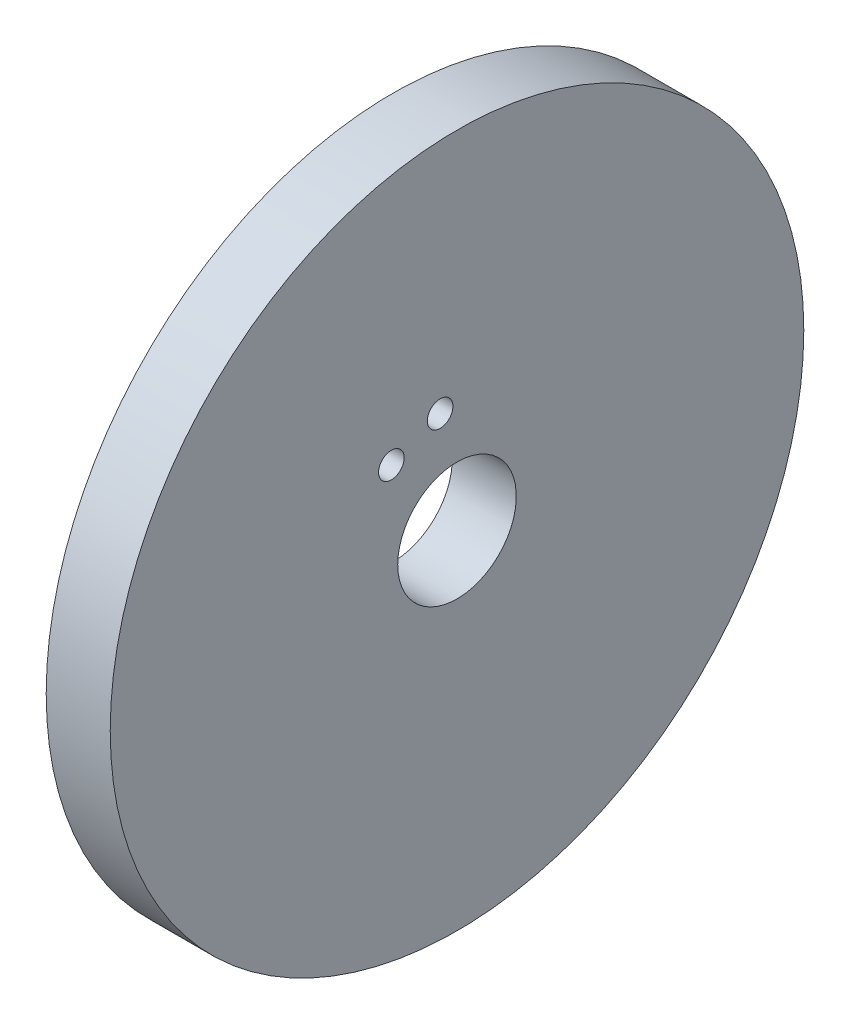
ISO-10303-21;
HEADER;
FILE_DESCRIPTION(('STEP AP214'),'2;1');
FILE_NAME('part.step','',(''),(''),'','','');
FILE_SCHEMA(('AUTOMOTIVE_DESIGN { 1 0 10303 214 1 1 1 1 }'));
ENDSEC;
DATA;
#1=APPLICATION_CONTEXT('core data for automotive mechanical design processes');
#2=APPLICATION_PROTOCOL_DEFINITION('international standard','automotive_design',2000,#1);
#3=PRODUCT_CONTEXT('',#1,'mechanical');
#4=PRODUCT('Part','Part','',(#3));
#5=PRODUCT_RELATED_PRODUCT_CATEGORY('part','',(#4));
#6=PRODUCT_DEFINITION_FORMATION('','',#4);
#7=PRODUCT_DEFINITION_CONTEXT('part definition',#1,'design');
#8=PRODUCT_DEFINITION('design','',#6,#7);
#9=PRODUCT_DEFINITION_SHAPE('','',#8);
#10=(LENGTH_UNIT() NAMED_UNIT(*) SI_UNIT(.MILLI.,.METRE.));
#11=(NAMED_UNIT(*) PLANE_ANGLE_UNIT() SI_UNIT($,.RADIAN.));
#12=(NAMED_UNIT(*) SI_UNIT($,.STERADIAN.) SOLID_ANGLE_UNIT());
#13=UNCERTAINTY_MEASURE_WITH_UNIT(LENGTH_MEASURE(1.E-05),#10,'distance_accuracy_value','');
#14=(GEOMETRIC_REPRESENTATION_CONTEXT(3) GLOBAL_UNCERTAINTY_ASSIGNED_CONTEXT((#13)) GLOBAL_UNIT_ASSIGNED_CONTEXT((#10,
#11,#12)) REPRESENTATION_CONTEXT('',''));
#15=CARTESIAN_POINT('',(0.,0.,0.));
#16=DIRECTION('',(0.,0.,1.));
#17=DIRECTION('',(1.,0.,0.));
#18=AXIS2_PLACEMENT_3D('',#15,#16,#17);
#19=CARTESIAN_POINT('',(13.7,65.,0.));
#20=DIRECTION('',(1.,0.,0.));
#21=DIRECTION('',(0.,0.,-1.));
#22=AXIS2_PLACEMENT_3D('',#19,#20,#21);
#23=PLANE('',#22);
#24=CARTESIAN_POINT('',(13.7,34.6482322781408,-34.6482322781408));
#25=DIRECTION('',(1.,0.,0.));
#26=DIRECTION('',(0.,0.,-1.));
#27=AXIS2_PLACEMENT_3D('',#24,#25,#26);
#28=CIRCLE('',#27,1.3);
#29=CARTESIAN_POINT('',(13.7,34.6482322781408,-35.9482322781408));
#30=VERTEX_POINT('',#29);
#31=EDGE_CURVE('E69',#30,#30,#28,.T.);
#32=ORIENTED_EDGE('',*,*,#31,.T.);
#33=EDGE_LOOP('',(#32));
#34=FACE_BOUND('',#33,.T.);
#35=CARTESIAN_POINT('',(13.7,-34.6482322781408,-34.6482322781408));
#36=DIRECTION('',(1.,0.,0.));
#37=DIRECTION('',(0.,0.,-1.));
#38=AXIS2_PLACEMENT_3D('',#35,#36,#37);
#39=CIRCLE('',#38,1.3);
#40=CARTESIAN_POINT('',(13.7,-34.6482322781408,-35.9482322781408));
#41=VERTEX_POINT('',#40);
#42=EDGE_CURVE('E75',#41,#41,#39,.T.);
#43=ORIENTED_EDGE('',*,*,#42,.T.);
#44=EDGE_LOOP('',(#43));
#45=FACE_BOUND('',#44,.T.);
#46=CARTESIAN_POINT('',(13.7,-34.6482322781408,34.6482322781408));
#47=DIRECTION('',(1.,0.,0.));
#48=DIRECTION('',(0.,0.,-1.));
#49=AXIS2_PLACEMENT_3D('',#46,#47,#48);
#50=CIRCLE('',#49,1.3);
#51=CARTESIAN_POINT('',(13.7,-34.6482322781408,33.3482322781408));
#52=VERTEX_POINT('',#51);
#53=EDGE_CURVE('E81',#52,#52,#50,.T.);
#54=ORIENTED_EDGE('',*,*,#53,.T.);
#55=EDGE_LOOP('',(#54));
#56=FACE_BOUND('',#55,.T.);
#57=CARTESIAN_POINT('',(13.7,34.6482322781408,34.6482322781408));
#58=DIRECTION('',(1.,0.,0.));
#59=DIRECTION('',(0.,0.,-1.));
#60=AXIS2_PLACEMENT_3D('',#57,#58,#59);
#61=CIRCLE('',#60,1.3);
#62=CARTESIAN_POINT('',(13.7,34.6482322781408,33.3482322781408));
#63=VERTEX_POINT('',#62);
#64=EDGE_CURVE('E63',#63,#63,#61,.T.);
#65=ORIENTED_EDGE('',*,*,#64,.T.);
#66=EDGE_LOOP('',(#65));
#67=FACE_BOUND('',#66,.T.);
#68=CARTESIAN_POINT('',(13.7,20.5579739264658,3.16381226351266));
#69=DIRECTION('',(1.,0.,0.));
#70=DIRECTION('',(0.,0.,-1.));
#71=AXIS2_PLACEMENT_3D('',#68,#69,#70);
#72=CIRCLE('',#71,2.4);
#73=CARTESIAN_POINT('',(13.7,20.5579739264658,0.763812263512656));
#74=VERTEX_POINT('',#73);
#75=EDGE_CURVE('E50',#74,#74,#72,.F.);
#76=ORIENTED_EDGE('',*,*,#75,.F.);
#77=EDGE_LOOP('',(#76));
#78=FACE_BOUND('',#77,.T.);
#79=CARTESIAN_POINT('',(13.7,16.7738358767911,12.2995296649292));
#80=DIRECTION('',(1.,0.,0.));
#81=DIRECTION('',(0.,0.,-1.));
#82=AXIS2_PLACEMENT_3D('',#79,#80,#81);
#83=CIRCLE('',#82,2.4);
#84=CARTESIAN_POINT('',(13.7,16.7738358767911,9.89952966492923));
#85=VERTEX_POINT('',#84);
#86=EDGE_CURVE('E53',#85,#85,#83,.F.);
#87=ORIENTED_EDGE('',*,*,#86,.F.);
#88=EDGE_LOOP('',(#87));
#89=FACE_BOUND('',#88,.T.);
#90=CARTESIAN_POINT('',(13.7,0.,0.));
#91=DIRECTION('',(-1.,0.,0.));
#92=DIRECTION('',(0.,0.,1.));
#93=AXIS2_PLACEMENT_3D('',#90,#91,#92);
#94=CIRCLE('',#93,11.1125);
#95=CARTESIAN_POINT('',(13.7,0.,11.1125));
#96=VERTEX_POINT('',#95);
#97=EDGE_CURVE('E10',#96,#96,#94,.T.);
#98=ORIENTED_EDGE('',*,*,#97,.F.);
#99=EDGE_LOOP('',(#98));
#100=FACE_BOUND('',#99,.T.);
#101=CARTESIAN_POINT('',(13.7,0.,0.));
#102=DIRECTION('',(-1.,0.,0.));
#103=DIRECTION('',(0.,0.,1.));
#104=AXIS2_PLACEMENT_3D('',#101,#102,#103);
#105=CIRCLE('',#104,65.);
#106=CARTESIAN_POINT('',(13.7,0.,65.));
#107=VERTEX_POINT('',#106);
#108=EDGE_CURVE('E45',#107,#107,#105,.T.);
#109=ORIENTED_EDGE('',*,*,#108,.T.);
#110=EDGE_LOOP('',(#109));
#111=FACE_BOUND('',#110,.T.);
#112=ADVANCED_FACE('F31',(#34,#45,#56,#67,#78,#89,#100,#111),#23,.F.);
#113=CARTESIAN_POINT('',(-110.,0.,0.));
#114=DIRECTION('',(-1.,0.,0.));
#115=DIRECTION('',(0.,0.,1.));
#116=AXIS2_PLACEMENT_3D('',#113,#114,#115);
#117=CYLINDRICAL_SURFACE('',#116,11.1125);
#118=CARTESIAN_POINT('',(25.7,0.,0.));
#119=DIRECTION('',(-1.,0.,0.));
#120=DIRECTION('',(0.,0.,1.));
#121=AXIS2_PLACEMENT_3D('',#118,#119,#120);
#122=CIRCLE('',#121,11.1125);
#123=CARTESIAN_POINT('',(25.7,0.,11.1125));
#124=VERTEX_POINT('',#123);
#125=EDGE_CURVE('E37',#124,#124,#122,.T.);
#126=ORIENTED_EDGE('',*,*,#125,.F.);
#127=EDGE_LOOP('',(#126));
#128=FACE_BOUND('',#127,.T.);
#129=ORIENTED_EDGE('',*,*,#97,.T.);
#130=EDGE_LOOP('',(#129));
#131=FACE_BOUND('',#130,.T.);
#132=ADVANCED_FACE('F104',(#128,#131),#117,.F.);
#133=CARTESIAN_POINT('',(25.7,11.1125,0.));
#134=DIRECTION('',(-1.,0.,0.));
#135=DIRECTION('',(0.,0.,1.));
#136=AXIS2_PLACEMENT_3D('',#133,#134,#135);
#137=PLANE('',#136);
#138=CARTESIAN_POINT('',(25.7,20.5579739264658,3.16381226351266));
#139=DIRECTION('',(1.,0.,0.));
#140=DIRECTION('',(0.,0.,-1.));
#141=AXIS2_PLACEMENT_3D('',#138,#139,#140);
#142=CIRCLE('',#141,2.4);
#143=CARTESIAN_POINT('',(25.7,20.5579739264658,0.763812263512656));
#144=VERTEX_POINT('',#143);
#145=EDGE_CURVE('E56',#144,#144,#142,.T.);
#146=ORIENTED_EDGE('',*,*,#145,.F.);
#147=EDGE_LOOP('',(#146));
#148=FACE_BOUND('',#147,.T.);
#149=CARTESIAN_POINT('',(25.7,16.7738358767911,12.2995296649292));
#150=DIRECTION('',(1.,0.,0.));
#151=DIRECTION('',(0.,0.,-1.));
#152=AXIS2_PLACEMENT_3D('',#149,#150,#151);
#153=CIRCLE('',#152,2.4);
#154=CARTESIAN_POINT('',(25.7,16.7738358767911,9.89952966492923));
#155=VERTEX_POINT('',#154);
#156=EDGE_CURVE('E57',#155,#155,#153,.T.);
#157=ORIENTED_EDGE('',*,*,#156,.F.);
#158=EDGE_LOOP('',(#157));
#159=FACE_BOUND('',#158,.T.);
#160=CARTESIAN_POINT('',(25.7,0.,0.));
#161=DIRECTION('',(-1.,0.,0.));
#162=DIRECTION('',(0.,0.,1.));
#163=AXIS2_PLACEMENT_3D('',#160,#161,#162);
#164=CIRCLE('',#163,65.);
#165=CARTESIAN_POINT('',(25.7,0.,65.));
#166=VERTEX_POINT('',#165);
#167=EDGE_CURVE('E41',#166,#166,#164,.T.);
#168=ORIENTED_EDGE('',*,*,#167,.F.);
#169=EDGE_LOOP('',(#168));
#170=FACE_BOUND('',#169,.T.);
#171=ORIENTED_EDGE('',*,*,#125,.T.);
#172=EDGE_LOOP('',(#171));
#173=FACE_BOUND('',#172,.T.);
#174=ADVANCED_FACE('F109',(#148,#159,#170,#173),#137,.F.);
#175=CARTESIAN_POINT('',(-110.,0.,0.));
#176=DIRECTION('',(-1.,0.,0.));
#177=DIRECTION('',(0.,0.,1.));
#178=AXIS2_PLACEMENT_3D('',#175,#176,#177);
#179=CYLINDRICAL_SURFACE('',#178,65.);
#180=ORIENTED_EDGE('',*,*,#108,.F.);
#181=EDGE_LOOP('',(#180));
#182=FACE_BOUND('',#181,.T.);
#183=ORIENTED_EDGE('',*,*,#167,.T.);
#184=EDGE_LOOP('',(#183));
#185=FACE_BOUND('',#184,.T.);
#186=ADVANCED_FACE('F126',(#182,#185),#179,.T.);
#187=CARTESIAN_POINT('',(25.7,16.7738358767911,12.2995296649292));
#188=DIRECTION('',(-1.,0.,0.));
#189=DIRECTION('',(0.,0.,1.));
#190=AXIS2_PLACEMENT_3D('',#187,#188,#189);
#191=CYLINDRICAL_SURFACE('',#190,2.4);
#192=ORIENTED_EDGE('',*,*,#156,.T.);
#193=EDGE_LOOP('',(#192));
#194=FACE_BOUND('',#193,.T.);
#195=ORIENTED_EDGE('',*,*,#86,.T.);
#196=EDGE_LOOP('',(#195));
#197=FACE_BOUND('',#196,.T.);
#198=ADVANCED_FACE('F129',(#194,#197),#191,.F.);
#199=CARTESIAN_POINT('',(25.7,20.5579739264658,3.16381226351266));
#200=DIRECTION('',(-1.,0.,0.));
#201=DIRECTION('',(0.,0.,1.));
#202=AXIS2_PLACEMENT_3D('',#199,#200,#201);
#203=CYLINDRICAL_SURFACE('',#202,2.4);
#204=ORIENTED_EDGE('',*,*,#145,.T.);
#205=EDGE_LOOP('',(#204));
#206=FACE_BOUND('',#205,.T.);
#207=ORIENTED_EDGE('',*,*,#75,.T.);
#208=EDGE_LOOP('',(#207));
#209=FACE_BOUND('',#208,.T.);
#210=ADVANCED_FACE('F143',(#206,#209),#203,.F.);
#211=CARTESIAN_POINT('',(20.7,34.6482322781408,34.6482322781408));
#212=DIRECTION('',(-1.,0.,0.));
#213=DIRECTION('',(0.,0.,1.));
#214=AXIS2_PLACEMENT_3D('',#211,#212,#213);
#215=CYLINDRICAL_SURFACE('',#214,1.3);
#216=CARTESIAN_POINT('',(20.7,34.6482322781408,34.6482322781408));
#217=DIRECTION('',(1.,0.,0.));
#218=DIRECTION('',(0.,0.,-1.));
#219=AXIS2_PLACEMENT_3D('',#216,#217,#218);
#220=CIRCLE('',#219,1.3);
#221=CARTESIAN_POINT('',(20.7,34.6482322781408,33.3482322781408));
#222=VERTEX_POINT('',#221);
#223=EDGE_CURVE('E60',#222,#222,#220,.T.);
#224=ORIENTED_EDGE('',*,*,#223,.T.);
#225=EDGE_LOOP('',(#224));
#226=FACE_BOUND('',#225,.T.);
#227=ORIENTED_EDGE('',*,*,#64,.F.);
#228=EDGE_LOOP('',(#227));
#229=FACE_BOUND('',#228,.T.);
#230=ADVANCED_FACE('F147',(#226,#229),#215,.F.);
#231=CARTESIAN_POINT('',(20.7,34.6482322781408,34.6482322781408));
#232=DIRECTION('',(1.,0.,0.));
#233=DIRECTION('',(0.,0.,-1.));
#234=AXIS2_PLACEMENT_3D('',#231,#232,#233);
#235=PLANE('',#234);
#236=ORIENTED_EDGE('',*,*,#223,.F.);
#237=EDGE_LOOP('',(#236));
#238=FACE_BOUND('',#237,.T.);
#239=ADVANCED_FACE('F101',(#238),#235,.F.);
#240=CARTESIAN_POINT('',(20.7,-34.6482322781408,34.6482322781408));
#241=DIRECTION('',(-1.,0.,0.));
#242=DIRECTION('',(0.,0.,1.));
#243=AXIS2_PLACEMENT_3D('',#240,#241,#242);
#244=CYLINDRICAL_SURFACE('',#243,1.3);
#245=CARTESIAN_POINT('',(20.7,-34.6482322781408,34.6482322781408));
#246=DIRECTION('',(1.,0.,0.));
#247=DIRECTION('',(0.,0.,-1.));
#248=AXIS2_PLACEMENT_3D('',#245,#246,#247);
#249=CIRCLE('',#248,1.3);
#250=CARTESIAN_POINT('',(20.7,-34.6482322781408,33.3482322781408));
#251=VERTEX_POINT('',#250);
#252=EDGE_CURVE('E66',#251,#251,#249,.T.);
#253=ORIENTED_EDGE('',*,*,#252,.T.);
#254=EDGE_LOOP('',(#253));
#255=FACE_BOUND('',#254,.T.);
#256=ORIENTED_EDGE('',*,*,#53,.F.);
#257=EDGE_LOOP('',(#256));
#258=FACE_BOUND('',#257,.T.);
#259=ADVANCED_FACE('F87',(#255,#258),#244,.F.);
#260=CARTESIAN_POINT('',(20.7,-34.6482322781408,34.6482322781408));
#261=DIRECTION('',(1.,0.,0.));
#262=DIRECTION('',(0.,0.,-1.));
#263=AXIS2_PLACEMENT_3D('',#260,#261,#262);
#264=PLANE('',#263);
#265=ORIENTED_EDGE('',*,*,#252,.F.);
#266=EDGE_LOOP('',(#265));
#267=FACE_BOUND('',#266,.T.);
#268=ADVANCED_FACE('F90',(#267),#264,.F.);
#269=CARTESIAN_POINT('',(20.7,-34.6482322781408,-34.6482322781408));
#270=DIRECTION('',(-1.,0.,0.));
#271=DIRECTION('',(0.,0.,1.));
#272=AXIS2_PLACEMENT_3D('',#269,#270,#271);
#273=CYLINDRICAL_SURFACE('',#272,1.3);
#274=CARTESIAN_POINT('',(20.7,-34.6482322781408,-34.6482322781408));
#275=DIRECTION('',(1.,0.,0.));
#276=DIRECTION('',(0.,0.,-1.));
#277=AXIS2_PLACEMENT_3D('',#274,#275,#276);
#278=CIRCLE('',#277,1.3);
#279=CARTESIAN_POINT('',(20.7,-34.6482322781408,-35.9482322781408));
#280=VERTEX_POINT('',#279);
#281=EDGE_CURVE('E78',#280,#280,#278,.T.);
#282=ORIENTED_EDGE('',*,*,#281,.T.);
#283=EDGE_LOOP('',(#282));
#284=FACE_BOUND('',#283,.T.);
#285=ORIENTED_EDGE('',*,*,#42,.F.);
#286=EDGE_LOOP('',(#285));
#287=FACE_BOUND('',#286,.T.);
#288=ADVANCED_FACE('F92',(#284,#287),#273,.F.);
#289=CARTESIAN_POINT('',(20.7,-34.6482322781408,-34.6482322781408));
#290=DIRECTION('',(1.,0.,0.));
#291=DIRECTION('',(0.,0.,-1.));
#292=AXIS2_PLACEMENT_3D('',#289,#290,#291);
#293=PLANE('',#292);
#294=ORIENTED_EDGE('',*,*,#281,.F.);
#295=EDGE_LOOP('',(#294));
#296=FACE_BOUND('',#295,.T.);
#297=ADVANCED_FACE('F98',(#296),#293,.F.);
#298=CARTESIAN_POINT('',(20.7,34.6482322781408,-34.6482322781408));
#299=DIRECTION('',(-1.,0.,0.));
#300=DIRECTION('',(0.,0.,1.));
#301=AXIS2_PLACEMENT_3D('',#298,#299,#300);
#302=CYLINDRICAL_SURFACE('',#301,1.3);
#303=CARTESIAN_POINT('',(20.7,34.6482322781408,-34.6482322781408));
#304=DIRECTION('',(1.,0.,0.));
#305=DIRECTION('',(0.,0.,-1.));
#306=AXIS2_PLACEMENT_3D('',#303,#304,#305);
#307=CIRCLE('',#306,1.3);
#308=CARTESIAN_POINT('',(20.7,34.6482322781408,-35.9482322781408));
#309=VERTEX_POINT('',#308);
#310=EDGE_CURVE('E72',#309,#309,#307,.T.);
#311=ORIENTED_EDGE('',*,*,#310,.T.);
#312=EDGE_LOOP('',(#311));
#313=FACE_BOUND('',#312,.T.);
#314=ORIENTED_EDGE('',*,*,#31,.F.);
#315=EDGE_LOOP('',(#314));
#316=FACE_BOUND('',#315,.T.);
#317=ADVANCED_FACE('F155',(#313,#316),#302,.F.);
#318=CARTESIAN_POINT('',(20.7,34.6482322781408,-34.6482322781408));
#319=DIRECTION('',(1.,0.,0.));
#320=DIRECTION('',(0.,0.,-1.));
#321=AXIS2_PLACEMENT_3D('',#318,#319,#320);
#322=PLANE('',#321);
#323=ORIENTED_EDGE('',*,*,#310,.F.);
#324=EDGE_LOOP('',(#323));
#325=FACE_BOUND('',#324,.T.);
#326=ADVANCED_FACE('F158',(#325),#322,.F.);
#327=CLOSED_SHELL('',(#112,#132,#174,#186,#198,#210,#230,#239,#259,#268,#288,#297,#317,#326));
#328=MANIFOLD_SOLID_BREP('B2',#327);
#329=ADVANCED_BREP_SHAPE_REPRESENTATION('',(#18,#328),#14);
#330=SHAPE_DEFINITION_REPRESENTATION(#9,#329);
ENDSEC;
END-ISO-10303-21;
